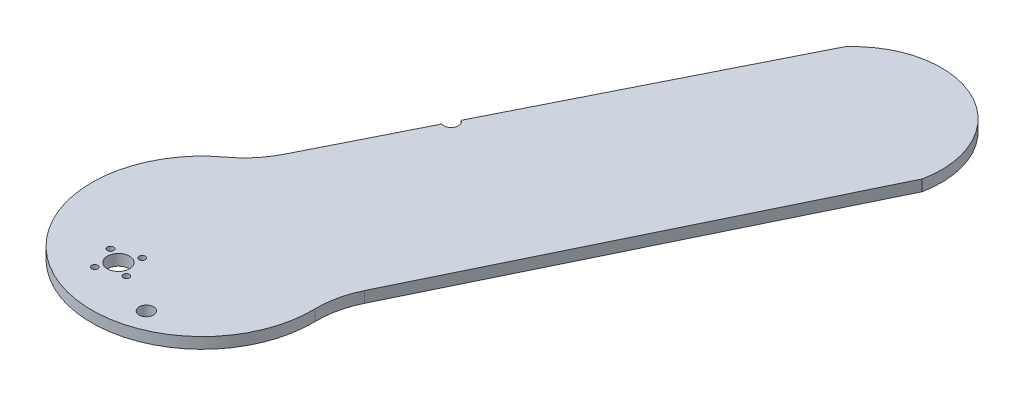
ISO-10303-21;
HEADER;
FILE_DESCRIPTION(('STEP AP214'),'2;1');
FILE_NAME('part.step','',(''),(''),'','','');
FILE_SCHEMA(('AUTOMOTIVE_DESIGN { 1 0 10303 214 1 1 1 1 }'));
ENDSEC;
DATA;
#1=APPLICATION_CONTEXT('core data for automotive mechanical design processes');
#2=APPLICATION_PROTOCOL_DEFINITION('international standard','automotive_design',2000,#1);
#3=PRODUCT_CONTEXT('',#1,'mechanical');
#4=PRODUCT('Part','Part','',(#3));
#5=PRODUCT_RELATED_PRODUCT_CATEGORY('part','',(#4));
#6=PRODUCT_DEFINITION_FORMATION('','',#4);
#7=PRODUCT_DEFINITION_CONTEXT('part definition',#1,'design');
#8=PRODUCT_DEFINITION('design','',#6,#7);
#9=PRODUCT_DEFINITION_SHAPE('','',#8);
#10=(LENGTH_UNIT() NAMED_UNIT(*) SI_UNIT(.MILLI.,.METRE.));
#11=(NAMED_UNIT(*) PLANE_ANGLE_UNIT() SI_UNIT($,.RADIAN.));
#12=(NAMED_UNIT(*) SI_UNIT($,.STERADIAN.) SOLID_ANGLE_UNIT());
#13=UNCERTAINTY_MEASURE_WITH_UNIT(LENGTH_MEASURE(1.E-05),#10,'distance_accuracy_value','');
#14=(GEOMETRIC_REPRESENTATION_CONTEXT(3) GLOBAL_UNCERTAINTY_ASSIGNED_CONTEXT((#13)) GLOBAL_UNIT_ASSIGNED_CONTEXT((#10,
#11,#12)) REPRESENTATION_CONTEXT('',''));
#15=CARTESIAN_POINT('',(0.,0.,0.));
#16=DIRECTION('',(0.,0.,1.));
#17=DIRECTION('',(1.,0.,0.));
#18=AXIS2_PLACEMENT_3D('',#15,#16,#17);
#19=CARTESIAN_POINT('',(-17.5649914606484,5.,-54.5785814241318));
#20=DIRECTION('',(0.893998273628023,0.,0.4480704037873));
#21=DIRECTION('',(0.4480704037873,0.,-0.893998273628023));
#22=AXIS2_PLACEMENT_3D('',#19,#20,#21);
#23=PLANE('',#22);
#24=DIRECTION('',(-0.4480704037873,0.,0.893998273628023));
#25=VECTOR('',#24,1.);
#26=CARTESIAN_POINT('',(-17.5649914606484,5.,-54.5785814241318));
#27=LINE('',#26,#25);
#28=CARTESIAN_POINT('',(6.26006166783913,5.,-102.114763653375));
#29=VERTEX_POINT('',#28);
#30=CARTESIAN_POINT('',(-17.5649914606484,5.,-54.5785814241318));
#31=VERTEX_POINT('',#30);
#32=EDGE_CURVE('E108',#29,#31,#27,.T.);
#33=ORIENTED_EDGE('',*,*,#32,.F.);
#34=DIRECTION('',(0.,-1.,0.));
#35=VECTOR('',#34,1.);
#36=CARTESIAN_POINT('',(6.26006166783912,19.,-102.114763653375));
#37=LINE('',#36,#35);
#38=CARTESIAN_POINT('',(6.26006166783912,0.,-102.114763653375));
#39=VERTEX_POINT('',#38);
#40=EDGE_CURVE('E171',#29,#39,#37,.T.);
#41=ORIENTED_EDGE('',*,*,#40,.T.);
#42=DIRECTION('',(-0.4480704037873,0.,0.893998273628023));
#43=VECTOR('',#42,1.);
#44=CARTESIAN_POINT('',(-17.5649914606484,0.,-54.5785814241318));
#45=LINE('',#44,#43);
#46=CARTESIAN_POINT('',(-17.5649914606484,0.,-54.5785814241318));
#47=VERTEX_POINT('',#46);
#48=EDGE_CURVE('E125',#39,#47,#45,.T.);
#49=ORIENTED_EDGE('',*,*,#48,.T.);
#50=DIRECTION('',(0.,-1.,0.));
#51=VECTOR('',#50,1.);
#52=CARTESIAN_POINT('',(-17.5649914606484,5.,-54.5785814241318));
#53=LINE('',#52,#51);
#54=EDGE_CURVE('E123',#31,#47,#53,.T.);
#55=ORIENTED_EDGE('',*,*,#54,.F.);
#56=EDGE_LOOP('',(#33,#41,#49,#55));
#57=FACE_BOUND('',#56,.T.);
#58=ADVANCED_FACE('F39',(#57),#23,.F.);
#59=CARTESIAN_POINT('',(89.9813207028475,5.,-1.83355517269121));
#60=DIRECTION('',(0.,-1.,0.));
#61=DIRECTION('',(0.,0.,-1.));
#62=AXIS2_PLACEMENT_3D('',#59,#60,#61);
#63=CYLINDRICAL_SURFACE('',#62,40.);
#64=CARTESIAN_POINT('',(89.9813207028475,0.,-1.83355517269121));
#65=DIRECTION('',(0.,-1.,0.));
#66=DIRECTION('',(0.,0.,1.));
#67=AXIS2_PLACEMENT_3D('',#64,#65,#66);
#68=CIRCLE('',#67,40.);
#69=CARTESIAN_POINT('',(49.9896226126931,0.,-1.0186417626062));
#70=VERTEX_POINT('',#69);
#71=CARTESIAN_POINT('',(53.9923447111492,0.,-19.2918943568452));
#72=VERTEX_POINT('',#71);
#73=EDGE_CURVE('E137',#70,#72,#68,.T.);
#74=ORIENTED_EDGE('',*,*,#73,.T.);
#75=DIRECTION('',(0.,-1.,0.));
#76=VECTOR('',#75,1.);
#77=CARTESIAN_POINT('',(53.9923447111492,5.,-19.2918943568452));
#78=LINE('',#77,#76);
#79=CARTESIAN_POINT('',(53.9923447111492,5.,-19.2918943568452));
#80=VERTEX_POINT('',#79);
#81=EDGE_CURVE('E11',#80,#72,#78,.T.);
#82=ORIENTED_EDGE('',*,*,#81,.F.);
#83=CARTESIAN_POINT('',(89.9813207028475,5.,-1.83355517269121));
#84=DIRECTION('',(0.,-1.,0.));
#85=DIRECTION('',(0.,0.,1.));
#86=AXIS2_PLACEMENT_3D('',#83,#84,#85);
#87=CIRCLE('',#86,40.);
#88=CARTESIAN_POINT('',(49.9896226126931,5.,-1.0186417626062));
#89=VERTEX_POINT('',#88);
#90=EDGE_CURVE('E151',#89,#80,#87,.T.);
#91=ORIENTED_EDGE('',*,*,#90,.F.);
#92=DIRECTION('',(0.,-1.,0.));
#93=VECTOR('',#92,1.);
#94=CARTESIAN_POINT('',(49.9896226126931,5.,-1.0186417626062));
#95=LINE('',#94,#93);
#96=EDGE_CURVE('E133',#89,#70,#95,.T.);
#97=ORIENTED_EDGE('',*,*,#96,.T.);
#98=EDGE_LOOP('',(#74,#82,#91,#97));
#99=FACE_BOUND('',#98,.T.);
#100=ADVANCED_FACE('F41',(#99),#63,.F.);
#101=CARTESIAN_POINT('',(53.9923447111492,5.,-19.2918943568452));
#102=DIRECTION('',(-0.899724399792457,0.,-0.436458479603849));
#103=DIRECTION('',(-0.436458479603849,0.,0.899724399792457));
#104=AXIS2_PLACEMENT_3D('',#101,#102,#103);
#105=PLANE('',#104);
#106=DIRECTION('',(0.436458479603849,0.,-0.899724399792457));
#107=VECTOR('',#106,1.);
#108=CARTESIAN_POINT('',(53.9923447111492,0.,-19.2918943568452));
#109=LINE('',#108,#107);
#110=CARTESIAN_POINT('',(136.424164558557,0.,-189.218526790073));
#111=VERTEX_POINT('',#110);
#112=EDGE_CURVE('E140',#72,#111,#109,.T.);
#113=ORIENTED_EDGE('',*,*,#112,.T.);
#114=DIRECTION('',(0.,-1.,0.));
#115=VECTOR('',#114,1.);
#116=CARTESIAN_POINT('',(136.424164558557,5.,-189.218526790073));
#117=LINE('',#116,#115);
#118=CARTESIAN_POINT('',(136.424164558557,5.,-189.218526790073));
#119=VERTEX_POINT('',#118);
#120=EDGE_CURVE('E47',#119,#111,#117,.T.);
#121=ORIENTED_EDGE('',*,*,#120,.F.);
#122=DIRECTION('',(0.436458479603849,0.,-0.899724399792457));
#123=VECTOR('',#122,1.);
#124=CARTESIAN_POINT('',(53.9923447111492,5.,-19.2918943568452));
#125=LINE('',#124,#123);
#126=EDGE_CURVE('E98',#80,#119,#125,.T.);
#127=ORIENTED_EDGE('',*,*,#126,.F.);
#128=ORIENTED_EDGE('',*,*,#81,.T.);
#129=EDGE_LOOP('',(#113,#121,#127,#128));
#130=FACE_BOUND('',#129,.T.);
#131=ADVANCED_FACE('F255',(#130),#105,.F.);
#132=CARTESIAN_POINT('',(97.2176217929201,5.,-197.146137045775));
#133=DIRECTION('',(0.,-1.,0.));
#134=DIRECTION('',(0.,0.,-1.));
#135=AXIS2_PLACEMENT_3D('',#132,#133,#134);
#136=CYLINDRICAL_SURFACE('',#135,40.);
#137=CARTESIAN_POINT('',(97.2176217929201,0.,-197.146137045775));
#138=DIRECTION('',(0.,1.,0.));
#139=DIRECTION('',(0.,0.,1.));
#140=AXIS2_PLACEMENT_3D('',#137,#138,#139);
#141=CIRCLE('',#140,40.);
#142=CARTESIAN_POINT('',(67.0599168180818,0.,-223.423747870403));
#143=VERTEX_POINT('',#142);
#144=EDGE_CURVE('E143',#111,#143,#141,.T.);
#145=ORIENTED_EDGE('',*,*,#144,.T.);
#146=DIRECTION('',(0.,-1.,0.));
#147=VECTOR('',#146,1.);
#148=CARTESIAN_POINT('',(67.0599168180818,5.,-223.423747870403));
#149=LINE('',#148,#147);
#150=CARTESIAN_POINT('',(67.0599168180818,5.,-223.423747870403));
#151=VERTEX_POINT('',#150);
#152=EDGE_CURVE('E128',#151,#143,#149,.T.);
#153=ORIENTED_EDGE('',*,*,#152,.F.);
#154=CARTESIAN_POINT('',(97.2176217929201,5.,-197.146137045775));
#155=DIRECTION('',(0.,1.,0.));
#156=DIRECTION('',(0.,0.,1.));
#157=AXIS2_PLACEMENT_3D('',#154,#155,#156);
#158=CIRCLE('',#157,40.);
#159=EDGE_CURVE('E120',#119,#151,#158,.T.);
#160=ORIENTED_EDGE('',*,*,#159,.F.);
#161=ORIENTED_EDGE('',*,*,#120,.T.);
#162=EDGE_LOOP('',(#145,#153,#160,#161));
#163=FACE_BOUND('',#162,.T.);
#164=ADVANCED_FACE('F159',(#163),#136,.T.);
#165=CARTESIAN_POINT('',(9.16160986201337,0.,-107.90398573659));
#166=VERTEX_POINT('',#165);
#167=EDGE_CURVE('E145',#143,#166,#45,.T.);
#168=ORIENTED_EDGE('',*,*,#167,.T.);
#169=DIRECTION('',(0.,-1.,0.));
#170=VECTOR('',#169,1.);
#171=CARTESIAN_POINT('',(9.16160986201336,19.,-107.90398573659));
#172=LINE('',#171,#170);
#173=CARTESIAN_POINT('',(9.16160986201337,5.,-107.90398573659));
#174=VERTEX_POINT('',#173);
#175=EDGE_CURVE('E54',#166,#174,#172,.F.);
#176=ORIENTED_EDGE('',*,*,#175,.T.);
#177=EDGE_CURVE('E119',#151,#174,#27,.T.);
#178=ORIENTED_EDGE('',*,*,#177,.F.);
#179=ORIENTED_EDGE('',*,*,#152,.T.);
#180=EDGE_LOOP('',(#168,#176,#178,#179));
#181=FACE_BOUND('',#180,.T.);
#182=ADVANCED_FACE('F167',(#181),#23,.F.);
#183=CARTESIAN_POINT('',(-53.3249224057694,5.,-72.5013975756238));
#184=DIRECTION('',(0.,-1.,0.));
#185=DIRECTION('',(0.,0.,-1.));
#186=AXIS2_PLACEMENT_3D('',#183,#184,#185);
#187=CYLINDRICAL_SURFACE('',#186,40.);
#188=CARTESIAN_POINT('',(-53.3249224057694,0.,-72.5013975756238));
#189=DIRECTION('',(0.,-1.,0.));
#190=DIRECTION('',(0.,0.,1.));
#191=AXIS2_PLACEMENT_3D('',#188,#189,#190);
#192=CIRCLE('',#191,40.);
#193=CARTESIAN_POINT('',(-29.6249568920941,0.,-40.2785542086799));
#194=VERTEX_POINT('',#193);
#195=EDGE_CURVE('E148',#47,#194,#192,.T.);
#196=ORIENTED_EDGE('',*,*,#195,.T.);
#197=DIRECTION('',(0.,-1.,0.));
#198=VECTOR('',#197,1.);
#199=CARTESIAN_POINT('',(-29.6249568920941,5.,-40.2785542086799));
#200=LINE('',#199,#198);
#201=CARTESIAN_POINT('',(-29.6249568920941,5.,-40.2785542086799));
#202=VERTEX_POINT('',#201);
#203=EDGE_CURVE('E129',#202,#194,#200,.T.);
#204=ORIENTED_EDGE('',*,*,#203,.F.);
#205=CARTESIAN_POINT('',(-53.3249224057694,5.,-72.5013975756238));
#206=DIRECTION('',(0.,-1.,0.));
#207=DIRECTION('',(0.,0.,1.));
#208=AXIS2_PLACEMENT_3D('',#205,#206,#207);
#209=CIRCLE('',#208,40.);
#210=EDGE_CURVE('E112',#31,#202,#209,.T.);
#211=ORIENTED_EDGE('',*,*,#210,.F.);
#212=ORIENTED_EDGE('',*,*,#54,.T.);
#213=EDGE_LOOP('',(#196,#204,#211,#212));
#214=FACE_BOUND('',#213,.T.);
#215=ADVANCED_FACE('F131',(#214),#187,.F.);
#216=CARTESIAN_POINT('',(0.,5.,0.));
#217=DIRECTION('',(0.,-1.,0.));
#218=DIRECTION('',(0.,0.,-1.));
#219=AXIS2_PLACEMENT_3D('',#216,#217,#218);
#220=CYLINDRICAL_SURFACE('',#219,50.);
#221=CARTESIAN_POINT('',(0.,0.,0.));
#222=DIRECTION('',(0.,1.,0.));
#223=DIRECTION('',(0.,0.,1.));
#224=AXIS2_PLACEMENT_3D('',#221,#222,#223);
#225=CIRCLE('',#224,50.);
#226=EDGE_CURVE('E90',#194,#70,#225,.T.);
#227=ORIENTED_EDGE('',*,*,#226,.T.);
#228=ORIENTED_EDGE('',*,*,#96,.F.);
#229=CARTESIAN_POINT('',(0.,5.,0.));
#230=DIRECTION('',(0.,1.,0.));
#231=DIRECTION('',(0.,0.,1.));
#232=AXIS2_PLACEMENT_3D('',#229,#230,#231);
#233=CIRCLE('',#232,50.);
#234=EDGE_CURVE('E63',#202,#89,#233,.T.);
#235=ORIENTED_EDGE('',*,*,#234,.F.);
#236=ORIENTED_EDGE('',*,*,#203,.T.);
#237=EDGE_LOOP('',(#227,#228,#235,#236));
#238=FACE_BOUND('',#237,.T.);
#239=ADVANCED_FACE('F178',(#238),#220,.T.);
#240=CARTESIAN_POINT('',(89.9813207028475,5.,-1.83355517269121));
#241=DIRECTION('',(0.,1.,0.));
#242=DIRECTION('',(0.,0.,1.));
#243=AXIS2_PLACEMENT_3D('',#240,#241,#242);
#244=PLANE('',#243);
#245=CARTESIAN_POINT('',(-16.2248623730261,5.,32.4546172514139));
#246=DIRECTION('',(0.,1.,0.));
#247=DIRECTION('',(0.,0.,1.));
#248=AXIS2_PLACEMENT_3D('',#245,#246,#247);
#249=CIRCLE('',#248,1.4);
#250=CARTESIAN_POINT('',(-16.2248623730261,5.,33.8546172514139));
#251=VERTEX_POINT('',#250);
#252=EDGE_CURVE('E175',#251,#251,#249,.T.);
#253=ORIENTED_EDGE('',*,*,#252,.F.);
#254=EDGE_LOOP('',(#253));
#255=FACE_BOUND('',#254,.T.);
#256=CARTESIAN_POINT('',(-9.07030782243479,5.,18.143350739235));
#257=DIRECTION('',(0.,1.,0.));
#258=DIRECTION('',(0.,0.,1.));
#259=AXIS2_PLACEMENT_3D('',#256,#257,#258);
#260=CIRCLE('',#259,1.4);
#261=CARTESIAN_POINT('',(-9.07030782243479,5.,19.543350739235));
#262=VERTEX_POINT('',#261);
#263=EDGE_CURVE('E193',#262,#262,#260,.T.);
#264=ORIENTED_EDGE('',*,*,#263,.F.);
#265=EDGE_LOOP('',(#264));
#266=FACE_BOUND('',#265,.T.);
#267=CARTESIAN_POINT('',(-5.491951841641,5.,28.8762612706199));
#268=DIRECTION('',(0.,1.,0.));
#269=DIRECTION('',(0.,0.,1.));
#270=AXIS2_PLACEMENT_3D('',#267,#268,#269);
#271=CIRCLE('',#270,1.4);
#272=CARTESIAN_POINT('',(-5.491951841641,5.,30.2762612706199));
#273=VERTEX_POINT('',#272);
#274=EDGE_CURVE('E196',#273,#273,#271,.T.);
#275=ORIENTED_EDGE('',*,*,#274,.F.);
#276=EDGE_LOOP('',(#275));
#277=FACE_BOUND('',#276,.T.);
#278=CARTESIAN_POINT('',(-12.6475850977305,5.,25.2989839953243));
#279=DIRECTION('',(0.,1.,0.));
#280=DIRECTION('',(0.,0.,1.));
#281=AXIS2_PLACEMENT_3D('',#278,#279,#280);
#282=CIRCLE('',#281,5.);
#283=CARTESIAN_POINT('',(-12.6475850977305,5.,30.2989839953243));
#284=VERTEX_POINT('',#283);
#285=EDGE_CURVE('E199',#284,#284,#282,.T.);
#286=ORIENTED_EDGE('',*,*,#285,.F.);
#287=EDGE_LOOP('',(#286));
#288=FACE_BOUND('',#287,.T.);
#289=CARTESIAN_POINT('',(-19.8032183538199,5.,21.7217067200286));
#290=DIRECTION('',(0.,1.,0.));
#291=DIRECTION('',(0.,0.,1.));
#292=AXIS2_PLACEMENT_3D('',#289,#290,#291);
#293=CIRCLE('',#292,1.4);
#294=CARTESIAN_POINT('',(-19.8032183538199,5.,23.1217067200286));
#295=VERTEX_POINT('',#294);
#296=EDGE_CURVE('E202',#295,#295,#293,.T.);
#297=ORIENTED_EDGE('',*,*,#296,.F.);
#298=EDGE_LOOP('',(#297));
#299=FACE_BOUND('',#298,.T.);
#300=CARTESIAN_POINT('',(12.6513988975935,5.,37.9465690930544));
#301=DIRECTION('',(0.,1.,0.));
#302=DIRECTION('',(0.,0.,1.));
#303=AXIS2_PLACEMENT_3D('',#300,#301,#302);
#304=CIRCLE('',#303,3.25);
#305=CARTESIAN_POINT('',(12.6513988975935,5.,41.1965690930544));
#306=VERTEX_POINT('',#305);
#307=EDGE_CURVE('E141',#306,#306,#304,.T.);
#308=ORIENTED_EDGE('',*,*,#307,.F.);
#309=EDGE_LOOP('',(#308));
#310=FACE_BOUND('',#309,.T.);
#311=CARTESIAN_POINT('',(7.45958974205764,5.,-105.13529877139));
#312=DIRECTION('',(0.,1.,0.));
#313=DIRECTION('',(0.,0.,1.));
#314=AXIS2_PLACEMENT_3D('',#311,#312,#313);
#315=CIRCLE('',#314,3.25);
#316=EDGE_CURVE('E116',#29,#174,#315,.T.);
#317=ORIENTED_EDGE('',*,*,#316,.F.);
#318=ORIENTED_EDGE('',*,*,#32,.T.);
#319=ORIENTED_EDGE('',*,*,#210,.T.);
#320=ORIENTED_EDGE('',*,*,#234,.T.);
#321=ORIENTED_EDGE('',*,*,#90,.T.);
#322=ORIENTED_EDGE('',*,*,#126,.T.);
#323=ORIENTED_EDGE('',*,*,#159,.T.);
#324=ORIENTED_EDGE('',*,*,#177,.T.);
#325=EDGE_LOOP('',(#317,#318,#319,#320,#321,#322,#323,#324));
#326=FACE_BOUND('',#325,.T.);
#327=ADVANCED_FACE('F110',(#255,#266,#277,#288,#299,#310,#326),#244,.T.);
#328=CARTESIAN_POINT('',(89.9813207028475,0.,-1.83355517269121));
#329=DIRECTION('',(0.,1.,0.));
#330=DIRECTION('',(0.,0.,1.));
#331=AXIS2_PLACEMENT_3D('',#328,#329,#330);
#332=PLANE('',#331);
#333=CARTESIAN_POINT('',(-16.2248623730261,0.,32.4546172514139));
#334=DIRECTION('',(0.,-1.,0.));
#335=DIRECTION('',(0.,0.,-1.));
#336=AXIS2_PLACEMENT_3D('',#333,#334,#335);
#337=CIRCLE('',#336,1.4);
#338=CARTESIAN_POINT('',(-16.2248623730261,0.,31.0546172514139));
#339=VERTEX_POINT('',#338);
#340=EDGE_CURVE('E205',#339,#339,#337,.T.);
#341=ORIENTED_EDGE('',*,*,#340,.F.);
#342=EDGE_LOOP('',(#341));
#343=FACE_BOUND('',#342,.T.);
#344=CARTESIAN_POINT('',(-9.07030782243479,0.,18.143350739235));
#345=DIRECTION('',(0.,-1.,0.));
#346=DIRECTION('',(0.,0.,-1.));
#347=AXIS2_PLACEMENT_3D('',#344,#345,#346);
#348=CIRCLE('',#347,1.4);
#349=CARTESIAN_POINT('',(-9.07030782243479,0.,16.743350739235));
#350=VERTEX_POINT('',#349);
#351=EDGE_CURVE('E213',#350,#350,#348,.T.);
#352=ORIENTED_EDGE('',*,*,#351,.F.);
#353=EDGE_LOOP('',(#352));
#354=FACE_BOUND('',#353,.T.);
#355=CARTESIAN_POINT('',(-5.491951841641,0.,28.8762612706199));
#356=DIRECTION('',(0.,-1.,0.));
#357=DIRECTION('',(0.,0.,-1.));
#358=AXIS2_PLACEMENT_3D('',#355,#356,#357);
#359=CIRCLE('',#358,1.4);
#360=CARTESIAN_POINT('',(-5.491951841641,0.,27.4762612706199));
#361=VERTEX_POINT('',#360);
#362=EDGE_CURVE('E210',#361,#361,#359,.T.);
#363=ORIENTED_EDGE('',*,*,#362,.F.);
#364=EDGE_LOOP('',(#363));
#365=FACE_BOUND('',#364,.T.);
#366=CARTESIAN_POINT('',(-12.6475850977305,0.,25.2989839953243));
#367=DIRECTION('',(0.,-1.,0.));
#368=DIRECTION('',(0.,0.,-1.));
#369=AXIS2_PLACEMENT_3D('',#366,#367,#368);
#370=CIRCLE('',#369,5.);
#371=CARTESIAN_POINT('',(-12.6475850977305,0.,20.2989839953243));
#372=VERTEX_POINT('',#371);
#373=EDGE_CURVE('E206',#372,#372,#370,.T.);
#374=ORIENTED_EDGE('',*,*,#373,.F.);
#375=EDGE_LOOP('',(#374));
#376=FACE_BOUND('',#375,.T.);
#377=CARTESIAN_POINT('',(-19.8032183538199,0.,21.7217067200286));
#378=DIRECTION('',(0.,-1.,0.));
#379=DIRECTION('',(0.,0.,-1.));
#380=AXIS2_PLACEMENT_3D('',#377,#378,#379);
#381=CIRCLE('',#380,1.4);
#382=CARTESIAN_POINT('',(-19.8032183538199,0.,20.3217067200286));
#383=VERTEX_POINT('',#382);
#384=EDGE_CURVE('E209',#383,#383,#381,.T.);
#385=ORIENTED_EDGE('',*,*,#384,.F.);
#386=EDGE_LOOP('',(#385));
#387=FACE_BOUND('',#386,.T.);
#388=CARTESIAN_POINT('',(12.6513988975935,0.,37.9465690930544));
#389=DIRECTION('',(0.,-1.,0.));
#390=DIRECTION('',(0.,0.,-1.));
#391=AXIS2_PLACEMENT_3D('',#388,#389,#390);
#392=CIRCLE('',#391,3.25);
#393=CARTESIAN_POINT('',(12.6513988975935,0.,34.6965690930544));
#394=VERTEX_POINT('',#393);
#395=EDGE_CURVE('E174',#394,#394,#392,.T.);
#396=ORIENTED_EDGE('',*,*,#395,.F.);
#397=EDGE_LOOP('',(#396));
#398=FACE_BOUND('',#397,.T.);
#399=ORIENTED_EDGE('',*,*,#48,.F.);
#400=CARTESIAN_POINT('',(7.45958974205764,0.,-105.13529877139));
#401=DIRECTION('',(0.,-1.,0.));
#402=DIRECTION('',(0.,0.,-1.));
#403=AXIS2_PLACEMENT_3D('',#400,#401,#402);
#404=CIRCLE('',#403,3.25);
#405=EDGE_CURVE('E165',#166,#39,#404,.T.);
#406=ORIENTED_EDGE('',*,*,#405,.F.);
#407=ORIENTED_EDGE('',*,*,#167,.F.);
#408=ORIENTED_EDGE('',*,*,#144,.F.);
#409=ORIENTED_EDGE('',*,*,#112,.F.);
#410=ORIENTED_EDGE('',*,*,#73,.F.);
#411=ORIENTED_EDGE('',*,*,#226,.F.);
#412=ORIENTED_EDGE('',*,*,#195,.F.);
#413=EDGE_LOOP('',(#399,#406,#407,#408,#409,#410,#411,#412));
#414=FACE_BOUND('',#413,.T.);
#415=ADVANCED_FACE('F163',(#343,#354,#365,#376,#387,#398,#414),#332,.F.);
#416=CARTESIAN_POINT('',(7.45958974205764,19.,-105.13529877139));
#417=DIRECTION('',(0.,-1.,0.));
#418=DIRECTION('',(0.,0.,-1.));
#419=AXIS2_PLACEMENT_3D('',#416,#417,#418);
#420=CYLINDRICAL_SURFACE('',#419,3.25);
#421=ORIENTED_EDGE('',*,*,#316,.T.);
#422=ORIENTED_EDGE('',*,*,#175,.F.);
#423=ORIENTED_EDGE('',*,*,#405,.T.);
#424=ORIENTED_EDGE('',*,*,#40,.F.);
#425=EDGE_LOOP('',(#421,#422,#423,#424));
#426=FACE_BOUND('',#425,.T.);
#427=ADVANCED_FACE('F173',(#426),#420,.F.);
#428=CARTESIAN_POINT('',(12.6513988975935,19.,37.9465690930544));
#429=DIRECTION('',(0.,-1.,0.));
#430=DIRECTION('',(0.,0.,-1.));
#431=AXIS2_PLACEMENT_3D('',#428,#429,#430);
#432=CYLINDRICAL_SURFACE('',#431,3.25);
#433=ORIENTED_EDGE('',*,*,#307,.T.);
#434=EDGE_LOOP('',(#433));
#435=FACE_BOUND('',#434,.T.);
#436=ORIENTED_EDGE('',*,*,#395,.T.);
#437=EDGE_LOOP('',(#436));
#438=FACE_BOUND('',#437,.T.);
#439=ADVANCED_FACE('F236',(#435,#438),#432,.F.);
#440=CARTESIAN_POINT('',(-19.8032183538199,16.3,21.7217067200286));
#441=DIRECTION('',(0.,-1.,0.));
#442=DIRECTION('',(0.,0.,-1.));
#443=AXIS2_PLACEMENT_3D('',#440,#441,#442);
#444=CYLINDRICAL_SURFACE('',#443,1.4);
#445=ORIENTED_EDGE('',*,*,#296,.T.);
#446=EDGE_LOOP('',(#445));
#447=FACE_BOUND('',#446,.T.);
#448=ORIENTED_EDGE('',*,*,#384,.T.);
#449=EDGE_LOOP('',(#448));
#450=FACE_BOUND('',#449,.T.);
#451=ADVANCED_FACE('F238',(#447,#450),#444,.F.);
#452=CARTESIAN_POINT('',(-12.6475850977305,16.3,25.2989839953243));
#453=DIRECTION('',(0.,-1.,0.));
#454=DIRECTION('',(0.,0.,-1.));
#455=AXIS2_PLACEMENT_3D('',#452,#453,#454);
#456=CYLINDRICAL_SURFACE('',#455,5.);
#457=ORIENTED_EDGE('',*,*,#285,.T.);
#458=EDGE_LOOP('',(#457));
#459=FACE_BOUND('',#458,.T.);
#460=ORIENTED_EDGE('',*,*,#373,.T.);
#461=EDGE_LOOP('',(#460));
#462=FACE_BOUND('',#461,.T.);
#463=ADVANCED_FACE('F245',(#459,#462),#456,.F.);
#464=CARTESIAN_POINT('',(-5.491951841641,16.3,28.8762612706199));
#465=DIRECTION('',(0.,-1.,0.));
#466=DIRECTION('',(0.,0.,-1.));
#467=AXIS2_PLACEMENT_3D('',#464,#465,#466);
#468=CYLINDRICAL_SURFACE('',#467,1.4);
#469=ORIENTED_EDGE('',*,*,#274,.T.);
#470=EDGE_LOOP('',(#469));
#471=FACE_BOUND('',#470,.T.);
#472=ORIENTED_EDGE('',*,*,#362,.T.);
#473=EDGE_LOOP('',(#472));
#474=FACE_BOUND('',#473,.T.);
#475=ADVANCED_FACE('F362',(#471,#474),#468,.F.);
#476=CARTESIAN_POINT('',(-9.07030782243479,16.3,18.143350739235));
#477=DIRECTION('',(0.,-1.,0.));
#478=DIRECTION('',(0.,0.,-1.));
#479=AXIS2_PLACEMENT_3D('',#476,#477,#478);
#480=CYLINDRICAL_SURFACE('',#479,1.4);
#481=ORIENTED_EDGE('',*,*,#263,.T.);
#482=EDGE_LOOP('',(#481));
#483=FACE_BOUND('',#482,.T.);
#484=ORIENTED_EDGE('',*,*,#351,.T.);
#485=EDGE_LOOP('',(#484));
#486=FACE_BOUND('',#485,.T.);
#487=ADVANCED_FACE('F372',(#483,#486),#480,.F.);
#488=CARTESIAN_POINT('',(-16.2248623730261,16.3,32.4546172514139));
#489=DIRECTION('',(0.,-1.,0.));
#490=DIRECTION('',(0.,0.,-1.));
#491=AXIS2_PLACEMENT_3D('',#488,#489,#490);
#492=CYLINDRICAL_SURFACE('',#491,1.4);
#493=ORIENTED_EDGE('',*,*,#252,.T.);
#494=EDGE_LOOP('',(#493));
#495=FACE_BOUND('',#494,.T.);
#496=ORIENTED_EDGE('',*,*,#340,.T.);
#497=EDGE_LOOP('',(#496));
#498=FACE_BOUND('',#497,.T.);
#499=ADVANCED_FACE('F221',(#495,#498),#492,.F.);
#500=CLOSED_SHELL('',(#58,#100,#131,#164,#182,#215,#239,#327,#415,#427,#439,#451,#463,#475,#487,#499));
#501=MANIFOLD_SOLID_BREP('B2',#500);
#502=ADVANCED_BREP_SHAPE_REPRESENTATION('',(#18,#501),#14);
#503=SHAPE_DEFINITION_REPRESENTATION(#9,#502);
ENDSEC;
END-ISO-10303-21;
